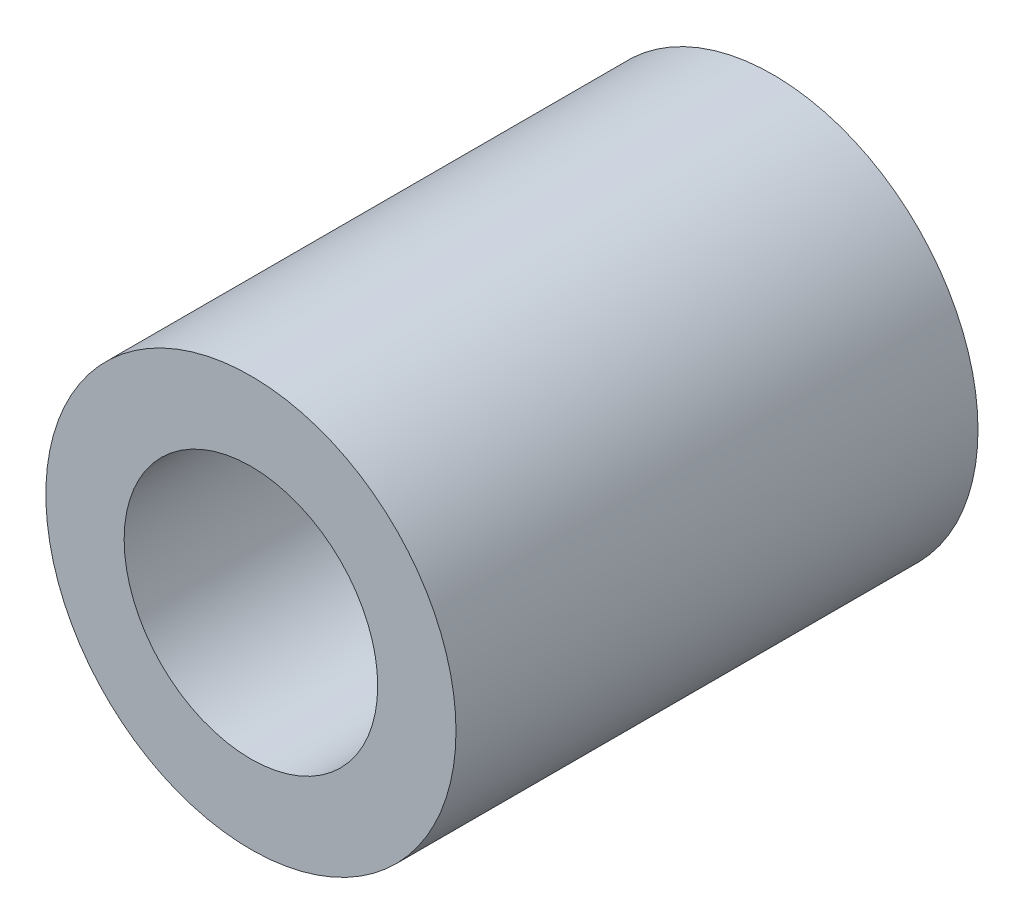
ISO-10303-21;
HEADER;
FILE_DESCRIPTION(('STEP AP214'),'2;1');
FILE_NAME('part.step','',(''),(''),'','','');
FILE_SCHEMA(('AUTOMOTIVE_DESIGN { 1 0 10303 214 1 1 1 1 }'));
ENDSEC;
DATA;
#1=APPLICATION_CONTEXT('core data for automotive mechanical design processes');
#2=APPLICATION_PROTOCOL_DEFINITION('international standard','automotive_design',2000,#1);
#3=PRODUCT_CONTEXT('',#1,'mechanical');
#4=PRODUCT('Part','Part','',(#3));
#5=PRODUCT_RELATED_PRODUCT_CATEGORY('part','',(#4));
#6=PRODUCT_DEFINITION_FORMATION('','',#4);
#7=PRODUCT_DEFINITION_CONTEXT('part definition',#1,'design');
#8=PRODUCT_DEFINITION('design','',#6,#7);
#9=PRODUCT_DEFINITION_SHAPE('','',#8);
#10=(LENGTH_UNIT() NAMED_UNIT(*) SI_UNIT(.MILLI.,.METRE.));
#11=(NAMED_UNIT(*) PLANE_ANGLE_UNIT() SI_UNIT($,.RADIAN.));
#12=(NAMED_UNIT(*) SI_UNIT($,.STERADIAN.) SOLID_ANGLE_UNIT());
#13=UNCERTAINTY_MEASURE_WITH_UNIT(LENGTH_MEASURE(1.E-05),#10,'distance_accuracy_value','');
#14=(GEOMETRIC_REPRESENTATION_CONTEXT(3) GLOBAL_UNCERTAINTY_ASSIGNED_CONTEXT((#13)) GLOBAL_UNIT_ASSIGNED_CONTEXT((#10,
#11,#12)) REPRESENTATION_CONTEXT('',''));
#15=CARTESIAN_POINT('',(0.,0.,0.));
#16=DIRECTION('',(0.,0.,1.));
#17=DIRECTION('',(1.,0.,0.));
#18=AXIS2_PLACEMENT_3D('',#15,#16,#17);
#19=CARTESIAN_POINT('',(0.,0.,7.));
#20=DIRECTION('',(0.,0.,1.));
#21=DIRECTION('',(1.,0.,0.));
#22=AXIS2_PLACEMENT_3D('',#19,#20,#21);
#23=PLANE('',#22);
#24=CARTESIAN_POINT('',(0.,0.,7.));
#25=DIRECTION('',(0.,0.,1.));
#26=DIRECTION('',(1.,0.,0.));
#27=AXIS2_PLACEMENT_3D('',#24,#25,#26);
#28=CIRCLE('',#27,2.75);
#29=CARTESIAN_POINT('',(2.75,0.,7.));
#30=VERTEX_POINT('',#29);
#31=EDGE_CURVE('E10',#30,#30,#28,.T.);
#32=ORIENTED_EDGE('',*,*,#31,.T.);
#33=EDGE_LOOP('',(#32));
#34=FACE_BOUND('',#33,.T.);
#35=CARTESIAN_POINT('',(0.,0.,7.));
#36=DIRECTION('',(0.,0.,1.));
#37=DIRECTION('',(1.,0.,0.));
#38=AXIS2_PLACEMENT_3D('',#35,#36,#37);
#39=CIRCLE('',#38,1.7);
#40=CARTESIAN_POINT('',(1.7,0.,7.));
#41=VERTEX_POINT('',#40);
#42=EDGE_CURVE('E56',#41,#41,#39,.T.);
#43=ORIENTED_EDGE('',*,*,#42,.F.);
#44=EDGE_LOOP('',(#43));
#45=FACE_BOUND('',#44,.T.);
#46=ADVANCED_FACE('F43',(#34,#45),#23,.T.);
#47=CARTESIAN_POINT('',(0.,0.,0.));
#48=DIRECTION('',(0.,0.,1.));
#49=DIRECTION('',(1.,0.,0.));
#50=AXIS2_PLACEMENT_3D('',#47,#48,#49);
#51=PLANE('',#50);
#52=CARTESIAN_POINT('',(0.,0.,0.));
#53=DIRECTION('',(0.,0.,1.));
#54=DIRECTION('',(1.,0.,0.));
#55=AXIS2_PLACEMENT_3D('',#52,#53,#54);
#56=CIRCLE('',#55,2.75);
#57=CARTESIAN_POINT('',(2.75,0.,0.));
#58=VERTEX_POINT('',#57);
#59=EDGE_CURVE('E47',#58,#58,#56,.T.);
#60=ORIENTED_EDGE('',*,*,#59,.F.);
#61=EDGE_LOOP('',(#60));
#62=FACE_BOUND('',#61,.T.);
#63=CARTESIAN_POINT('',(0.,0.,0.));
#64=DIRECTION('',(0.,0.,1.));
#65=DIRECTION('',(1.,0.,0.));
#66=AXIS2_PLACEMENT_3D('',#63,#64,#65);
#67=CIRCLE('',#66,1.7);
#68=CARTESIAN_POINT('',(1.7,0.,0.));
#69=VERTEX_POINT('',#68);
#70=EDGE_CURVE('E58',#69,#69,#67,.T.);
#71=ORIENTED_EDGE('',*,*,#70,.T.);
#72=EDGE_LOOP('',(#71));
#73=FACE_BOUND('',#72,.T.);
#74=ADVANCED_FACE('F70',(#62,#73),#51,.F.);
#75=CARTESIAN_POINT('',(0.,0.,7.));
#76=DIRECTION('',(0.,0.,-1.));
#77=DIRECTION('',(-1.,0.,0.));
#78=AXIS2_PLACEMENT_3D('',#75,#76,#77);
#79=CYLINDRICAL_SURFACE('',#78,2.75);
#80=ORIENTED_EDGE('',*,*,#31,.F.);
#81=EDGE_LOOP('',(#80));
#82=FACE_BOUND('',#81,.T.);
#83=ORIENTED_EDGE('',*,*,#59,.T.);
#84=EDGE_LOOP('',(#83));
#85=FACE_BOUND('',#84,.T.);
#86=ADVANCED_FACE('F45',(#82,#85),#79,.T.);
#87=CARTESIAN_POINT('',(0.,0.,7.));
#88=DIRECTION('',(0.,0.,-1.));
#89=DIRECTION('',(-1.,0.,0.));
#90=AXIS2_PLACEMENT_3D('',#87,#88,#89);
#91=CYLINDRICAL_SURFACE('',#90,1.7);
#92=ORIENTED_EDGE('',*,*,#42,.T.);
#93=EDGE_LOOP('',(#92));
#94=FACE_BOUND('',#93,.T.);
#95=ORIENTED_EDGE('',*,*,#70,.F.);
#96=EDGE_LOOP('',(#95));
#97=FACE_BOUND('',#96,.T.);
#98=ADVANCED_FACE('F66',(#94,#97),#91,.F.);
#99=CLOSED_SHELL('',(#46,#74,#86,#98));
#100=MANIFOLD_SOLID_BREP('B2',#99);
#101=ADVANCED_BREP_SHAPE_REPRESENTATION('',(#18,#100),#14);
#102=SHAPE_DEFINITION_REPRESENTATION(#9,#101);
ENDSEC;
END-ISO-10303-21;
